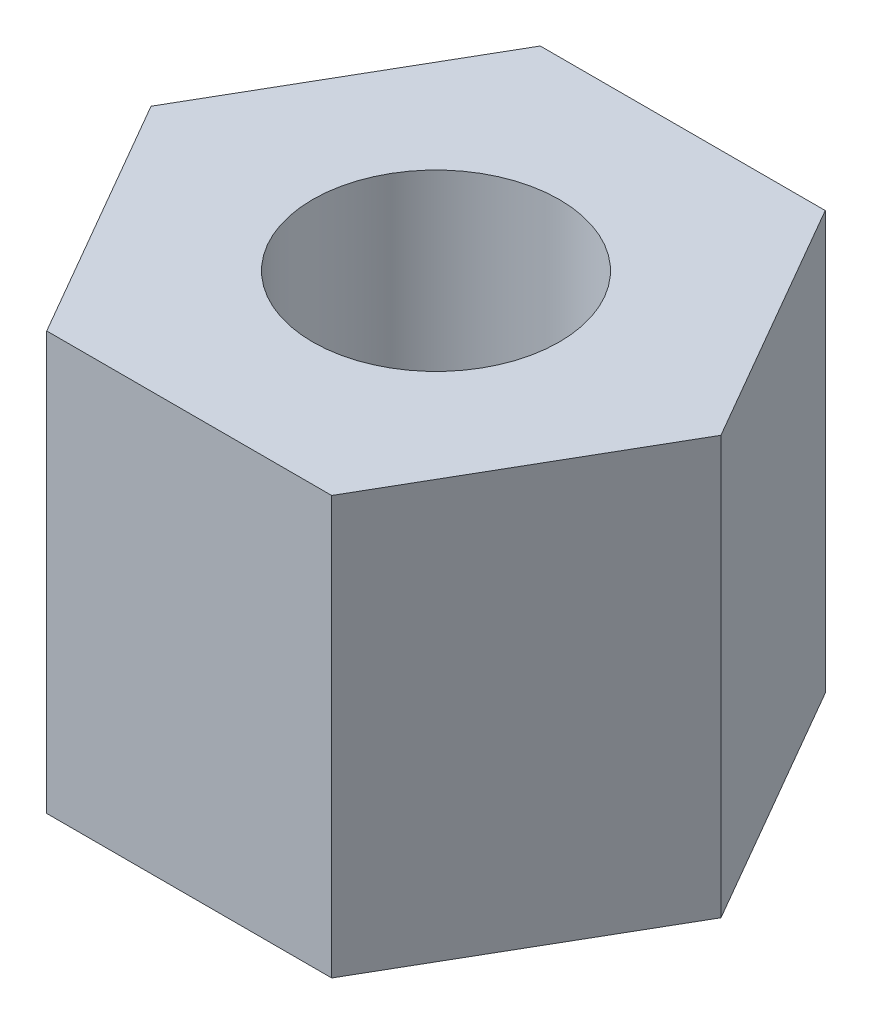
ISO-10303-21;
HEADER;
FILE_DESCRIPTION(('STEP AP214'),'2;1');
FILE_NAME('part.step','',(''),(''),'','','');
FILE_SCHEMA(('AUTOMOTIVE_DESIGN { 1 0 10303 214 1 1 1 1 }'));
ENDSEC;
DATA;
#1=APPLICATION_CONTEXT('core data for automotive mechanical design processes');
#2=APPLICATION_PROTOCOL_DEFINITION('international standard','automotive_design',2000,#1);
#3=PRODUCT_CONTEXT('',#1,'mechanical');
#4=PRODUCT('Part','Part','',(#3));
#5=PRODUCT_RELATED_PRODUCT_CATEGORY('part','',(#4));
#6=PRODUCT_DEFINITION_FORMATION('','',#4);
#7=PRODUCT_DEFINITION_CONTEXT('part definition',#1,'design');
#8=PRODUCT_DEFINITION('design','',#6,#7);
#9=PRODUCT_DEFINITION_SHAPE('','',#8);
#10=(LENGTH_UNIT() NAMED_UNIT(*) SI_UNIT(.MILLI.,.METRE.));
#11=(NAMED_UNIT(*) PLANE_ANGLE_UNIT() SI_UNIT($,.RADIAN.));
#12=(NAMED_UNIT(*) SI_UNIT($,.STERADIAN.) SOLID_ANGLE_UNIT());
#13=UNCERTAINTY_MEASURE_WITH_UNIT(LENGTH_MEASURE(1.E-05),#10,'distance_accuracy_value','');
#14=(GEOMETRIC_REPRESENTATION_CONTEXT(3) GLOBAL_UNCERTAINTY_ASSIGNED_CONTEXT((#13)) GLOBAL_UNIT_ASSIGNED_CONTEXT((#10,
#11,#12)) REPRESENTATION_CONTEXT('',''));
#15=CARTESIAN_POINT('',(0.,0.,0.));
#16=DIRECTION('',(0.,0.,1.));
#17=DIRECTION('',(1.,0.,0.));
#18=AXIS2_PLACEMENT_3D('',#15,#16,#17);
#19=CARTESIAN_POINT('',(0.,2.54,0.));
#20=DIRECTION('',(0.,1.,0.));
#21=DIRECTION('',(0.,0.,1.));
#22=AXIS2_PLACEMENT_3D('',#19,#20,#21);
#23=PLANE('',#22);
#24=DIRECTION('',(0.500000000000001,0.,0.866025403784438));
#25=VECTOR('',#24,1.);
#26=CARTESIAN_POINT('',(-3.46410161513776,2.54,0.));
#27=LINE('',#26,#25);
#28=CARTESIAN_POINT('',(-3.46410161513776,2.54,0.));
#29=VERTEX_POINT('',#28);
#30=CARTESIAN_POINT('',(-1.73205080756888,2.54,3.));
#31=VERTEX_POINT('',#30);
#32=EDGE_CURVE('E143',#29,#31,#27,.T.);
#33=ORIENTED_EDGE('',*,*,#32,.T.);
#34=DIRECTION('',(1.,0.,0.));
#35=VECTOR('',#34,1.);
#36=CARTESIAN_POINT('',(-1.73205080756888,2.54,3.));
#37=LINE('',#36,#35);
#38=CARTESIAN_POINT('',(1.73205080756888,2.54,3.));
#39=VERTEX_POINT('',#38);
#40=EDGE_CURVE('E101',#31,#39,#37,.T.);
#41=ORIENTED_EDGE('',*,*,#40,.T.);
#42=DIRECTION('',(0.5,0.,-0.866025403784439));
#43=VECTOR('',#42,1.);
#44=CARTESIAN_POINT('',(1.73205080756888,2.54,3.));
#45=LINE('',#44,#43);
#46=CARTESIAN_POINT('',(3.46410161513776,2.54,0.));
#47=VERTEX_POINT('',#46);
#48=EDGE_CURVE('E114',#39,#47,#45,.T.);
#49=ORIENTED_EDGE('',*,*,#48,.T.);
#50=DIRECTION('',(-0.500000000000001,0.,-0.866025403784438));
#51=VECTOR('',#50,1.);
#52=CARTESIAN_POINT('',(3.46410161513776,2.54,0.));
#53=LINE('',#52,#51);
#54=CARTESIAN_POINT('',(1.73205080756888,2.54,-3.));
#55=VERTEX_POINT('',#54);
#56=EDGE_CURVE('E108',#47,#55,#53,.T.);
#57=ORIENTED_EDGE('',*,*,#56,.T.);
#58=DIRECTION('',(-1.,0.,0.));
#59=VECTOR('',#58,1.);
#60=CARTESIAN_POINT('',(1.73205080756888,2.54,-3.));
#61=LINE('',#60,#59);
#62=CARTESIAN_POINT('',(-1.73205080756888,2.54,-3.));
#63=VERTEX_POINT('',#62);
#64=EDGE_CURVE('E112',#55,#63,#61,.T.);
#65=ORIENTED_EDGE('',*,*,#64,.T.);
#66=DIRECTION('',(-0.5,0.,0.866025403784439));
#67=VECTOR('',#66,1.);
#68=CARTESIAN_POINT('',(-1.73205080756888,2.54,-3.));
#69=LINE('',#68,#67);
#70=EDGE_CURVE('E64',#63,#29,#69,.T.);
#71=ORIENTED_EDGE('',*,*,#70,.T.);
#72=EDGE_LOOP('',(#33,#41,#49,#57,#65,#71));
#73=FACE_BOUND('',#72,.T.);
#74=CARTESIAN_POINT('',(0.,2.54,0.));
#75=DIRECTION('',(0.,1.,0.));
#76=DIRECTION('',(0.,0.,1.));
#77=AXIS2_PLACEMENT_3D('',#74,#75,#76);
#78=CIRCLE('',#77,1.5);
#79=CARTESIAN_POINT('',(0.,2.54,1.5));
#80=VERTEX_POINT('',#79);
#81=EDGE_CURVE('E136',#80,#80,#78,.T.);
#82=ORIENTED_EDGE('',*,*,#81,.F.);
#83=EDGE_LOOP('',(#82));
#84=FACE_BOUND('',#83,.T.);
#85=ADVANCED_FACE('F47',(#73,#84),#23,.T.);
#86=CARTESIAN_POINT('',(0.,-2.54,0.));
#87=DIRECTION('',(0.,1.,0.));
#88=DIRECTION('',(0.,0.,1.));
#89=AXIS2_PLACEMENT_3D('',#86,#87,#88);
#90=PLANE('',#89);
#91=DIRECTION('',(0.500000000000001,0.,0.866025403784438));
#92=VECTOR('',#91,1.);
#93=CARTESIAN_POINT('',(-3.46410161513776,-2.54,0.));
#94=LINE('',#93,#92);
#95=CARTESIAN_POINT('',(-3.46410161513776,-2.54,0.));
#96=VERTEX_POINT('',#95);
#97=CARTESIAN_POINT('',(-1.73205080756888,-2.54,3.));
#98=VERTEX_POINT('',#97);
#99=EDGE_CURVE('E132',#96,#98,#94,.T.);
#100=ORIENTED_EDGE('',*,*,#99,.F.);
#101=DIRECTION('',(-0.5,0.,0.866025403784439));
#102=VECTOR('',#101,1.);
#103=CARTESIAN_POINT('',(-1.73205080756888,-2.54,-3.));
#104=LINE('',#103,#102);
#105=CARTESIAN_POINT('',(-1.73205080756888,-2.54,-3.));
#106=VERTEX_POINT('',#105);
#107=EDGE_CURVE('E93',#106,#96,#104,.T.);
#108=ORIENTED_EDGE('',*,*,#107,.F.);
#109=DIRECTION('',(-1.,0.,0.));
#110=VECTOR('',#109,1.);
#111=CARTESIAN_POINT('',(1.73205080756888,-2.54,-3.));
#112=LINE('',#111,#110);
#113=CARTESIAN_POINT('',(1.73205080756888,-2.54,-3.));
#114=VERTEX_POINT('',#113);
#115=EDGE_CURVE('E87',#114,#106,#112,.T.);
#116=ORIENTED_EDGE('',*,*,#115,.F.);
#117=DIRECTION('',(-0.500000000000001,0.,-0.866025403784438));
#118=VECTOR('',#117,1.);
#119=CARTESIAN_POINT('',(3.46410161513776,-2.54,0.));
#120=LINE('',#119,#118);
#121=CARTESIAN_POINT('',(3.46410161513776,-2.54,0.));
#122=VERTEX_POINT('',#121);
#123=EDGE_CURVE('E122',#122,#114,#120,.T.);
#124=ORIENTED_EDGE('',*,*,#123,.F.);
#125=DIRECTION('',(0.5,0.,-0.866025403784439));
#126=VECTOR('',#125,1.);
#127=CARTESIAN_POINT('',(1.73205080756888,-2.54,3.));
#128=LINE('',#127,#126);
#129=CARTESIAN_POINT('',(1.73205080756888,-2.54,3.));
#130=VERTEX_POINT('',#129);
#131=EDGE_CURVE('E138',#130,#122,#128,.T.);
#132=ORIENTED_EDGE('',*,*,#131,.F.);
#133=DIRECTION('',(1.,0.,0.));
#134=VECTOR('',#133,1.);
#135=CARTESIAN_POINT('',(-1.73205080756888,-2.54,3.));
#136=LINE('',#135,#134);
#137=EDGE_CURVE('E135',#98,#130,#136,.T.);
#138=ORIENTED_EDGE('',*,*,#137,.F.);
#139=EDGE_LOOP('',(#100,#108,#116,#124,#132,#138));
#140=FACE_BOUND('',#139,.T.);
#141=CARTESIAN_POINT('',(0.,-2.54,0.));
#142=DIRECTION('',(0.,1.,0.));
#143=DIRECTION('',(0.,0.,1.));
#144=AXIS2_PLACEMENT_3D('',#141,#142,#143);
#145=CIRCLE('',#144,1.5);
#146=CARTESIAN_POINT('',(0.,-2.54,1.5));
#147=VERTEX_POINT('',#146);
#148=EDGE_CURVE('E236',#147,#147,#145,.T.);
#149=ORIENTED_EDGE('',*,*,#148,.T.);
#150=EDGE_LOOP('',(#149));
#151=FACE_BOUND('',#150,.T.);
#152=ADVANCED_FACE('F152',(#140,#151),#90,.F.);
#153=CARTESIAN_POINT('',(-3.46410161513776,2.54,0.));
#154=DIRECTION('',(0.866025403784438,0.,-0.500000000000001));
#155=DIRECTION('',(-0.500000000000001,0.,-0.866025403784438));
#156=AXIS2_PLACEMENT_3D('',#153,#154,#155);
#157=PLANE('',#156);
#158=ORIENTED_EDGE('',*,*,#99,.T.);
#159=DIRECTION('',(0.,-1.,0.));
#160=VECTOR('',#159,1.);
#161=CARTESIAN_POINT('',(-1.73205080756888,2.54,3.));
#162=LINE('',#161,#160);
#163=EDGE_CURVE('E13',#31,#98,#162,.T.);
#164=ORIENTED_EDGE('',*,*,#163,.F.);
#165=ORIENTED_EDGE('',*,*,#32,.F.);
#166=DIRECTION('',(0.,-1.,0.));
#167=VECTOR('',#166,1.);
#168=CARTESIAN_POINT('',(-3.46410161513776,2.54,0.));
#169=LINE('',#168,#167);
#170=EDGE_CURVE('E128',#29,#96,#169,.T.);
#171=ORIENTED_EDGE('',*,*,#170,.T.);
#172=EDGE_LOOP('',(#158,#164,#165,#171));
#173=FACE_BOUND('',#172,.T.);
#174=ADVANCED_FACE('F49',(#173),#157,.F.);
#175=CARTESIAN_POINT('',(-1.73205080756888,2.54,3.));
#176=DIRECTION('',(0.,0.,-1.));
#177=DIRECTION('',(-1.,0.,0.));
#178=AXIS2_PLACEMENT_3D('',#175,#176,#177);
#179=PLANE('',#178);
#180=ORIENTED_EDGE('',*,*,#137,.T.);
#181=DIRECTION('',(0.,-1.,0.));
#182=VECTOR('',#181,1.);
#183=CARTESIAN_POINT('',(1.73205080756888,2.54,3.));
#184=LINE('',#183,#182);
#185=EDGE_CURVE('E56',#39,#130,#184,.T.);
#186=ORIENTED_EDGE('',*,*,#185,.F.);
#187=ORIENTED_EDGE('',*,*,#40,.F.);
#188=ORIENTED_EDGE('',*,*,#163,.T.);
#189=EDGE_LOOP('',(#180,#186,#187,#188));
#190=FACE_BOUND('',#189,.T.);
#191=ADVANCED_FACE('F177',(#190),#179,.F.);
#192=CARTESIAN_POINT('',(1.73205080756888,2.54,3.));
#193=DIRECTION('',(-0.866025403784439,0.,-0.5));
#194=DIRECTION('',(-0.5,0.,0.866025403784439));
#195=AXIS2_PLACEMENT_3D('',#192,#193,#194);
#196=PLANE('',#195);
#197=ORIENTED_EDGE('',*,*,#131,.T.);
#198=DIRECTION('',(0.,-1.,0.));
#199=VECTOR('',#198,1.);
#200=CARTESIAN_POINT('',(3.46410161513776,2.54,0.));
#201=LINE('',#200,#199);
#202=EDGE_CURVE('E123',#47,#122,#201,.T.);
#203=ORIENTED_EDGE('',*,*,#202,.F.);
#204=ORIENTED_EDGE('',*,*,#48,.F.);
#205=ORIENTED_EDGE('',*,*,#185,.T.);
#206=EDGE_LOOP('',(#197,#203,#204,#205));
#207=FACE_BOUND('',#206,.T.);
#208=ADVANCED_FACE('F149',(#207),#196,.F.);
#209=CARTESIAN_POINT('',(3.46410161513776,2.54,0.));
#210=DIRECTION('',(-0.866025403784438,0.,0.500000000000001));
#211=DIRECTION('',(0.500000000000001,0.,0.866025403784438));
#212=AXIS2_PLACEMENT_3D('',#209,#210,#211);
#213=PLANE('',#212);
#214=ORIENTED_EDGE('',*,*,#123,.T.);
#215=DIRECTION('',(0.,-1.,0.));
#216=VECTOR('',#215,1.);
#217=CARTESIAN_POINT('',(1.73205080756888,2.54,-3.));
#218=LINE('',#217,#216);
#219=EDGE_CURVE('E119',#55,#114,#218,.T.);
#220=ORIENTED_EDGE('',*,*,#219,.F.);
#221=ORIENTED_EDGE('',*,*,#56,.F.);
#222=ORIENTED_EDGE('',*,*,#202,.T.);
#223=EDGE_LOOP('',(#214,#220,#221,#222));
#224=FACE_BOUND('',#223,.T.);
#225=ADVANCED_FACE('F120',(#224),#213,.F.);
#226=CARTESIAN_POINT('',(1.73205080756888,2.54,-3.));
#227=DIRECTION('',(0.,0.,1.));
#228=DIRECTION('',(1.,0.,0.));
#229=AXIS2_PLACEMENT_3D('',#226,#227,#228);
#230=PLANE('',#229);
#231=ORIENTED_EDGE('',*,*,#115,.T.);
#232=DIRECTION('',(0.,-1.,0.));
#233=VECTOR('',#232,1.);
#234=CARTESIAN_POINT('',(-1.73205080756888,2.54,-3.));
#235=LINE('',#234,#233);
#236=EDGE_CURVE('E124',#63,#106,#235,.T.);
#237=ORIENTED_EDGE('',*,*,#236,.F.);
#238=ORIENTED_EDGE('',*,*,#64,.F.);
#239=ORIENTED_EDGE('',*,*,#219,.T.);
#240=EDGE_LOOP('',(#231,#237,#238,#239));
#241=FACE_BOUND('',#240,.T.);
#242=ADVANCED_FACE('F126',(#241),#230,.F.);
#243=CARTESIAN_POINT('',(-1.73205080756888,2.54,-3.));
#244=DIRECTION('',(0.866025403784439,0.,0.5));
#245=DIRECTION('',(0.5,0.,-0.866025403784439));
#246=AXIS2_PLACEMENT_3D('',#243,#244,#245);
#247=PLANE('',#246);
#248=ORIENTED_EDGE('',*,*,#107,.T.);
#249=ORIENTED_EDGE('',*,*,#170,.F.);
#250=ORIENTED_EDGE('',*,*,#70,.F.);
#251=ORIENTED_EDGE('',*,*,#236,.T.);
#252=EDGE_LOOP('',(#248,#249,#250,#251));
#253=FACE_BOUND('',#252,.T.);
#254=ADVANCED_FACE('F157',(#253),#247,.F.);
#255=CARTESIAN_POINT('',(0.,2.54,0.));
#256=DIRECTION('',(0.,-1.,0.));
#257=DIRECTION('',(0.,0.,-1.));
#258=AXIS2_PLACEMENT_3D('',#255,#256,#257);
#259=CYLINDRICAL_SURFACE('',#258,1.5);
#260=ORIENTED_EDGE('',*,*,#81,.T.);
#261=EDGE_LOOP('',(#260));
#262=FACE_BOUND('',#261,.T.);
#263=ORIENTED_EDGE('',*,*,#148,.F.);
#264=EDGE_LOOP('',(#263));
#265=FACE_BOUND('',#264,.T.);
#266=ADVANCED_FACE('F159',(#262,#265),#259,.F.);
#267=CLOSED_SHELL('',(#85,#152,#174,#191,#208,#225,#242,#254,#266));
#268=MANIFOLD_SOLID_BREP('B2',#267);
#269=ADVANCED_BREP_SHAPE_REPRESENTATION('',(#18,#268),#14);
#270=SHAPE_DEFINITION_REPRESENTATION(#9,#269);
ENDSEC;
END-ISO-10303-21;
